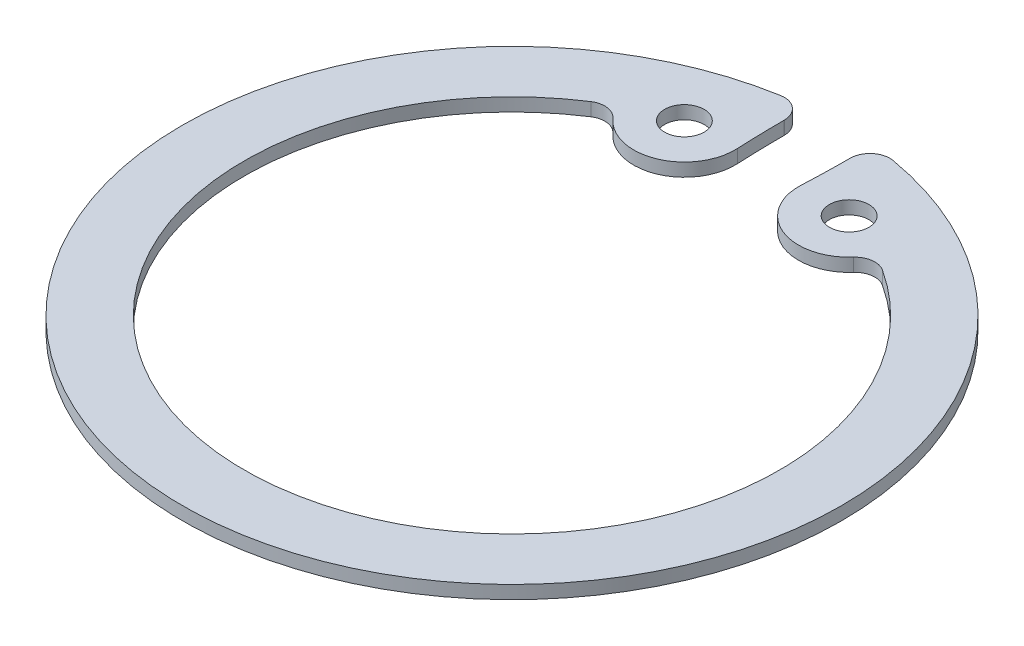
ISO-10303-21;
HEADER;
FILE_DESCRIPTION(('STEP AP214'),'2;1');
FILE_NAME('part.step','',(''),(''),'','','');
FILE_SCHEMA(('AUTOMOTIVE_DESIGN { 1 0 10303 214 1 1 1 1 }'));
ENDSEC;
DATA;
#1=APPLICATION_CONTEXT('core data for automotive mechanical design processes');
#2=APPLICATION_PROTOCOL_DEFINITION('international standard','automotive_design',2000,#1);
#3=PRODUCT_CONTEXT('',#1,'mechanical');
#4=PRODUCT('Part','Part','',(#3));
#5=PRODUCT_RELATED_PRODUCT_CATEGORY('part','',(#4));
#6=PRODUCT_DEFINITION_FORMATION('','',#4);
#7=PRODUCT_DEFINITION_CONTEXT('part definition',#1,'design');
#8=PRODUCT_DEFINITION('design','',#6,#7);
#9=PRODUCT_DEFINITION_SHAPE('','',#8);
#10=(LENGTH_UNIT() NAMED_UNIT(*) SI_UNIT(.MILLI.,.METRE.));
#11=(NAMED_UNIT(*) PLANE_ANGLE_UNIT() SI_UNIT($,.RADIAN.));
#12=(NAMED_UNIT(*) SI_UNIT($,.STERADIAN.) SOLID_ANGLE_UNIT());
#13=UNCERTAINTY_MEASURE_WITH_UNIT(LENGTH_MEASURE(1.E-05),#10,'distance_accuracy_value','');
#14=(GEOMETRIC_REPRESENTATION_CONTEXT(3) GLOBAL_UNCERTAINTY_ASSIGNED_CONTEXT((#13)) GLOBAL_UNIT_ASSIGNED_CONTEXT((#10,
#11,#12)) REPRESENTATION_CONTEXT('',''));
#15=CARTESIAN_POINT('',(0.,0.,0.));
#16=DIRECTION('',(0.,0.,1.));
#17=DIRECTION('',(1.,0.,0.));
#18=AXIS2_PLACEMENT_3D('',#15,#16,#17);
#19=CARTESIAN_POINT('',(0.,0.508,0.));
#20=DIRECTION('',(0.,1.,0.));
#21=DIRECTION('',(0.,0.,1.));
#22=AXIS2_PLACEMENT_3D('',#19,#20,#21);
#23=PLANE('',#22);
#24=CARTESIAN_POINT('',(0.,0.508,0.));
#25=DIRECTION('',(0.,1.,0.));
#26=DIRECTION('',(0.,0.,1.));
#27=AXIS2_PLACEMENT_3D('',#24,#25,#26);
#28=CIRCLE('',#27,10.31875);
#29=CARTESIAN_POINT('',(-5.61818155112389,0.508,-8.65520869887671));
#30=VERTEX_POINT('',#29);
#31=CARTESIAN_POINT('',(5.61818155112389,0.508,-8.65520869887671));
#32=VERTEX_POINT('',#31);
#33=EDGE_CURVE('E189',#30,#32,#28,.T.);
#34=ORIENTED_EDGE('',*,*,#33,.F.);
#35=CARTESIAN_POINT('',(-5.20330045196397,0.508,-8.01605482572889));
#36=DIRECTION('',(0.,-1.,0.));
#37=DIRECTION('',(0.,0.,1.));
#38=AXIS2_PLACEMENT_3D('',#35,#36,#37);
#39=CIRCLE('',#38,0.762);
#40=CARTESIAN_POINT('',(-4.63365696517477,0.508,-8.5221677557738));
#41=VERTEX_POINT('',#40);
#42=EDGE_CURVE('E158',#41,#30,#39,.F.);
#43=ORIENTED_EDGE('',*,*,#42,.F.);
#44=CARTESIAN_POINT('',(-3.175,0.508,-9.81814527100205));
#45=DIRECTION('',(0.,-1.,0.));
#46=DIRECTION('',(0.,0.,1.));
#47=AXIS2_PLACEMENT_3D('',#44,#45,#46);
#48=CIRCLE('',#47,1.95121445823622);
#49=CARTESIAN_POINT('',(-1.22599498104189,0.508,-9.91097467424356));
#50=VERTEX_POINT('',#49);
#51=EDGE_CURVE('E297',#50,#41,#48,.T.);
#52=ORIENTED_EDGE('',*,*,#51,.F.);
#53=CARTESIAN_POINT('',(37.592,0.508,-11.7598418008393));
#54=DIRECTION('',(0.,-1.,0.));
#55=DIRECTION('',(0.,0.,1.));
#56=AXIS2_PLACEMENT_3D('',#53,#54,#55);
#57=CIRCLE('',#56,38.862);
#58=CARTESIAN_POINT('',(-1.27,0.508,-11.7598418008393));
#59=VERTEX_POINT('',#58);
#60=EDGE_CURVE('E168',#59,#50,#57,.F.);
#61=ORIENTED_EDGE('',*,*,#60,.F.);
#62=DIRECTION('',(0.,0.,-1.));
#63=VECTOR('',#62,1.);
#64=CARTESIAN_POINT('',(-1.27,0.508,-9.15960984272477));
#65=LINE('',#64,#63);
#66=CARTESIAN_POINT('',(-1.27,0.508,-11.76379275574));
#67=VERTEX_POINT('',#66);
#68=EDGE_CURVE('E147',#59,#67,#65,.T.);
#69=ORIENTED_EDGE('',*,*,#68,.T.);
#70=CARTESIAN_POINT('',(-2.032,0.508,-11.76379275574));
#71=DIRECTION('',(0.,-1.,0.));
#72=DIRECTION('',(0.,0.,1.));
#73=AXIS2_PLACEMENT_3D('',#70,#71,#72);
#74=CIRCLE('',#73,0.762);
#75=CARTESIAN_POINT('',(-2.16170212765957,0.508,-12.5146731444042));
#76=VERTEX_POINT('',#75);
#77=EDGE_CURVE('E138',#76,#67,#74,.T.);
#78=ORIENTED_EDGE('',*,*,#77,.F.);
#79=CARTESIAN_POINT('',(0.,0.508,0.));
#80=DIRECTION('',(0.,1.,0.));
#81=DIRECTION('',(0.,0.,1.));
#82=AXIS2_PLACEMENT_3D('',#79,#80,#81);
#83=CIRCLE('',#82,12.7);
#84=CARTESIAN_POINT('',(2.16170212765957,0.508,-12.5146731444042));
#85=VERTEX_POINT('',#84);
#86=EDGE_CURVE('E123',#76,#85,#83,.T.);
#87=ORIENTED_EDGE('',*,*,#86,.T.);
#88=CARTESIAN_POINT('',(2.032,0.508,-11.76379275574));
#89=DIRECTION('',(0.,1.,0.));
#90=DIRECTION('',(0.,0.,1.));
#91=AXIS2_PLACEMENT_3D('',#88,#89,#90);
#92=CIRCLE('',#91,0.762);
#93=CARTESIAN_POINT('',(1.27,0.508,-11.76379275574));
#94=VERTEX_POINT('',#93);
#95=EDGE_CURVE('E199',#85,#94,#92,.T.);
#96=ORIENTED_EDGE('',*,*,#95,.T.);
#97=DIRECTION('',(0.,0.,-1.));
#98=VECTOR('',#97,1.);
#99=CARTESIAN_POINT('',(1.27,0.508,-9.15960984272477));
#100=LINE('',#99,#98);
#101=CARTESIAN_POINT('',(1.27,0.508,-11.7598418008393));
#102=VERTEX_POINT('',#101);
#103=EDGE_CURVE('E183',#102,#94,#100,.T.);
#104=ORIENTED_EDGE('',*,*,#103,.F.);
#105=CARTESIAN_POINT('',(-37.592,0.508,-11.7598418008393));
#106=DIRECTION('',(0.,1.,0.));
#107=DIRECTION('',(0.,0.,1.));
#108=AXIS2_PLACEMENT_3D('',#105,#106,#107);
#109=CIRCLE('',#108,38.862);
#110=CARTESIAN_POINT('',(1.22599498104189,0.508,-9.91097467424356));
#111=VERTEX_POINT('',#110);
#112=EDGE_CURVE('E44',#102,#111,#109,.F.);
#113=ORIENTED_EDGE('',*,*,#112,.T.);
#114=CARTESIAN_POINT('',(3.175,0.508,-9.81814527100205));
#115=DIRECTION('',(0.,1.,0.));
#116=DIRECTION('',(0.,0.,1.));
#117=AXIS2_PLACEMENT_3D('',#114,#115,#116);
#118=CIRCLE('',#117,1.95121445823622);
#119=CARTESIAN_POINT('',(4.63365696517477,0.508,-8.5221677557738));
#120=VERTEX_POINT('',#119);
#121=EDGE_CURVE('E178',#111,#120,#118,.T.);
#122=ORIENTED_EDGE('',*,*,#121,.T.);
#123=CARTESIAN_POINT('',(5.20330045196397,0.508,-8.01605482572889));
#124=DIRECTION('',(0.,1.,0.));
#125=DIRECTION('',(0.,0.,1.));
#126=AXIS2_PLACEMENT_3D('',#123,#124,#125);
#127=CIRCLE('',#126,0.762);
#128=EDGE_CURVE('E209',#120,#32,#127,.F.);
#129=ORIENTED_EDGE('',*,*,#128,.T.);
#130=EDGE_LOOP('',(#34,#43,#52,#61,#69,#78,#87,#96,#104,#113,#122,#129));
#131=FACE_BOUND('',#130,.T.);
#132=CARTESIAN_POINT('',(3.175,0.508,-9.81814527100205));
#133=DIRECTION('',(0.,1.,0.));
#134=DIRECTION('',(0.,0.,1.));
#135=AXIS2_PLACEMENT_3D('',#132,#133,#134);
#136=CIRCLE('',#135,0.762);
#137=CARTESIAN_POINT('',(3.175,0.508,-9.05614527100205));
#138=VERTEX_POINT('',#137);
#139=EDGE_CURVE('E174',#138,#138,#136,.T.);
#140=ORIENTED_EDGE('',*,*,#139,.F.);
#141=EDGE_LOOP('',(#140));
#142=FACE_BOUND('',#141,.T.);
#143=CARTESIAN_POINT('',(-3.175,0.508,-9.81814527100205));
#144=DIRECTION('',(0.,-1.,0.));
#145=DIRECTION('',(0.,0.,1.));
#146=AXIS2_PLACEMENT_3D('',#143,#144,#145);
#147=CIRCLE('',#146,0.762);
#148=CARTESIAN_POINT('',(-3.175,0.508,-9.05614527100205));
#149=VERTEX_POINT('',#148);
#150=EDGE_CURVE('E294',#149,#149,#147,.T.);
#151=ORIENTED_EDGE('',*,*,#150,.T.);
#152=EDGE_LOOP('',(#151));
#153=FACE_BOUND('',#152,.T.);
#154=ADVANCED_FACE('F36',(#131,#142,#153),#23,.T.);
#155=CARTESIAN_POINT('',(0.,0.,0.));
#156=DIRECTION('',(0.,1.,0.));
#157=DIRECTION('',(0.,0.,1.));
#158=AXIS2_PLACEMENT_3D('',#155,#156,#157);
#159=PLANE('',#158);
#160=CARTESIAN_POINT('',(3.175,0.,-9.81814527100205));
#161=DIRECTION('',(0.,1.,0.));
#162=DIRECTION('',(0.,0.,1.));
#163=AXIS2_PLACEMENT_3D('',#160,#161,#162);
#164=CIRCLE('',#163,0.762);
#165=CARTESIAN_POINT('',(3.175,0.,-9.05614527100205));
#166=VERTEX_POINT('',#165);
#167=EDGE_CURVE('E175',#166,#166,#164,.T.);
#168=ORIENTED_EDGE('',*,*,#167,.T.);
#169=EDGE_LOOP('',(#168));
#170=FACE_BOUND('',#169,.T.);
#171=CARTESIAN_POINT('',(0.,0.,0.));
#172=DIRECTION('',(0.,1.,0.));
#173=DIRECTION('',(0.,0.,1.));
#174=AXIS2_PLACEMENT_3D('',#171,#172,#173);
#175=CIRCLE('',#174,12.7);
#176=CARTESIAN_POINT('',(-2.16170212765957,0.,-12.5146731444042));
#177=VERTEX_POINT('',#176);
#178=CARTESIAN_POINT('',(2.16170212765957,0.,-12.5146731444042));
#179=VERTEX_POINT('',#178);
#180=EDGE_CURVE('E133',#177,#179,#175,.T.);
#181=ORIENTED_EDGE('',*,*,#180,.F.);
#182=CARTESIAN_POINT('',(-2.032,0.,-11.76379275574));
#183=DIRECTION('',(0.,-1.,0.));
#184=DIRECTION('',(0.,0.,1.));
#185=AXIS2_PLACEMENT_3D('',#182,#183,#184);
#186=CIRCLE('',#185,0.762);
#187=CARTESIAN_POINT('',(-1.27,0.,-11.76379275574));
#188=VERTEX_POINT('',#187);
#189=EDGE_CURVE('E141',#188,#177,#186,.F.);
#190=ORIENTED_EDGE('',*,*,#189,.F.);
#191=DIRECTION('',(0.,0.,-1.));
#192=VECTOR('',#191,1.);
#193=CARTESIAN_POINT('',(-1.27,0.,-9.15960984272477));
#194=LINE('',#193,#192);
#195=CARTESIAN_POINT('',(-1.27,0.,-11.7598418008393));
#196=VERTEX_POINT('',#195);
#197=EDGE_CURVE('E142',#196,#188,#194,.T.);
#198=ORIENTED_EDGE('',*,*,#197,.F.);
#199=CARTESIAN_POINT('',(37.592,0.,-11.7598418008393));
#200=DIRECTION('',(0.,-1.,0.));
#201=DIRECTION('',(0.,0.,1.));
#202=AXIS2_PLACEMENT_3D('',#199,#200,#201);
#203=CIRCLE('',#202,38.862);
#204=CARTESIAN_POINT('',(-1.22599498104189,0.,-9.91097467424356));
#205=VERTEX_POINT('',#204);
#206=EDGE_CURVE('E171',#205,#196,#203,.T.);
#207=ORIENTED_EDGE('',*,*,#206,.F.);
#208=CARTESIAN_POINT('',(-3.175,0.,-9.81814527100205));
#209=DIRECTION('',(0.,-1.,0.));
#210=DIRECTION('',(0.,0.,1.));
#211=AXIS2_PLACEMENT_3D('',#208,#209,#210);
#212=CIRCLE('',#211,1.95121445823622);
#213=CARTESIAN_POINT('',(-4.63365696517477,0.,-8.5221677557738));
#214=VERTEX_POINT('',#213);
#215=EDGE_CURVE('E300',#205,#214,#212,.T.);
#216=ORIENTED_EDGE('',*,*,#215,.T.);
#217=CARTESIAN_POINT('',(-5.20330045196397,0.,-8.01605482572889));
#218=DIRECTION('',(0.,-1.,0.));
#219=DIRECTION('',(0.,0.,1.));
#220=AXIS2_PLACEMENT_3D('',#217,#218,#219);
#221=CIRCLE('',#220,0.762);
#222=CARTESIAN_POINT('',(-5.61818155112389,0.,-8.65520869887671));
#223=VERTEX_POINT('',#222);
#224=EDGE_CURVE('E161',#223,#214,#221,.T.);
#225=ORIENTED_EDGE('',*,*,#224,.F.);
#226=CARTESIAN_POINT('',(0.,0.,0.));
#227=DIRECTION('',(0.,1.,0.));
#228=DIRECTION('',(0.,0.,1.));
#229=AXIS2_PLACEMENT_3D('',#226,#227,#228);
#230=CIRCLE('',#229,10.31875);
#231=CARTESIAN_POINT('',(5.61818155112389,0.,-8.65520869887671));
#232=VERTEX_POINT('',#231);
#233=EDGE_CURVE('E187',#223,#232,#230,.T.);
#234=ORIENTED_EDGE('',*,*,#233,.T.);
#235=CARTESIAN_POINT('',(5.20330045196397,0.,-8.01605482572889));
#236=DIRECTION('',(0.,1.,0.));
#237=DIRECTION('',(0.,0.,1.));
#238=AXIS2_PLACEMENT_3D('',#235,#236,#237);
#239=CIRCLE('',#238,0.762);
#240=CARTESIAN_POINT('',(4.63365696517477,0.,-8.5221677557738));
#241=VERTEX_POINT('',#240);
#242=EDGE_CURVE('E211',#232,#241,#239,.T.);
#243=ORIENTED_EDGE('',*,*,#242,.T.);
#244=CARTESIAN_POINT('',(3.175,0.,-9.81814527100205));
#245=DIRECTION('',(0.,1.,0.));
#246=DIRECTION('',(0.,0.,1.));
#247=AXIS2_PLACEMENT_3D('',#244,#245,#246);
#248=CIRCLE('',#247,1.95121445823622);
#249=CARTESIAN_POINT('',(1.22599498104189,0.,-9.91097467424356));
#250=VERTEX_POINT('',#249);
#251=EDGE_CURVE('E181',#250,#241,#248,.T.);
#252=ORIENTED_EDGE('',*,*,#251,.F.);
#253=CARTESIAN_POINT('',(-37.592,0.,-11.7598418008393));
#254=DIRECTION('',(0.,1.,0.));
#255=DIRECTION('',(0.,0.,1.));
#256=AXIS2_PLACEMENT_3D('',#253,#254,#255);
#257=CIRCLE('',#256,38.862);
#258=CARTESIAN_POINT('',(1.27,0.,-11.7598418008393));
#259=VERTEX_POINT('',#258);
#260=EDGE_CURVE('E11',#250,#259,#257,.T.);
#261=ORIENTED_EDGE('',*,*,#260,.T.);
#262=DIRECTION('',(0.,0.,-1.));
#263=VECTOR('',#262,1.);
#264=CARTESIAN_POINT('',(1.27,0.,-9.15960984272477));
#265=LINE('',#264,#263);
#266=CARTESIAN_POINT('',(1.27,0.,-11.76379275574));
#267=VERTEX_POINT('',#266);
#268=EDGE_CURVE('E185',#259,#267,#265,.T.);
#269=ORIENTED_EDGE('',*,*,#268,.T.);
#270=CARTESIAN_POINT('',(2.032,0.,-11.76379275574));
#271=DIRECTION('',(0.,1.,0.));
#272=DIRECTION('',(0.,0.,1.));
#273=AXIS2_PLACEMENT_3D('',#270,#271,#272);
#274=CIRCLE('',#273,0.762);
#275=EDGE_CURVE('E196',#267,#179,#274,.F.);
#276=ORIENTED_EDGE('',*,*,#275,.T.);
#277=EDGE_LOOP('',(#181,#190,#198,#207,#216,#225,#234,#243,#252,#261,#269,#276));
#278=FACE_BOUND('',#277,.T.);
#279=CARTESIAN_POINT('',(-3.175,0.,-9.81814527100205));
#280=DIRECTION('',(0.,-1.,0.));
#281=DIRECTION('',(0.,0.,1.));
#282=AXIS2_PLACEMENT_3D('',#279,#280,#281);
#283=CIRCLE('',#282,0.762);
#284=CARTESIAN_POINT('',(-3.175,0.,-9.05614527100205));
#285=VERTEX_POINT('',#284);
#286=EDGE_CURVE('E291',#285,#285,#283,.T.);
#287=ORIENTED_EDGE('',*,*,#286,.F.);
#288=EDGE_LOOP('',(#287));
#289=FACE_BOUND('',#288,.T.);
#290=ADVANCED_FACE('F228',(#170,#278,#289),#159,.F.);
#291=CARTESIAN_POINT('',(0.,0.508,0.));
#292=DIRECTION('',(0.,-1.,0.));
#293=DIRECTION('',(0.,0.,-1.));
#294=AXIS2_PLACEMENT_3D('',#291,#292,#293);
#295=CYLINDRICAL_SURFACE('',#294,12.7);
#296=ORIENTED_EDGE('',*,*,#86,.F.);
#297=DIRECTION('',(0.,-1.,0.));
#298=VECTOR('',#297,1.);
#299=CARTESIAN_POINT('',(-2.16170212765958,0.508,-12.5146731444042));
#300=LINE('',#299,#298);
#301=EDGE_CURVE('E126',#177,#76,#300,.F.);
#302=ORIENTED_EDGE('',*,*,#301,.F.);
#303=ORIENTED_EDGE('',*,*,#180,.T.);
#304=DIRECTION('',(0.,-1.,0.));
#305=VECTOR('',#304,1.);
#306=CARTESIAN_POINT('',(2.16170212765958,0.508,-12.5146731444042));
#307=LINE('',#306,#305);
#308=EDGE_CURVE('E129',#179,#85,#307,.F.);
#309=ORIENTED_EDGE('',*,*,#308,.T.);
#310=EDGE_LOOP('',(#296,#302,#303,#309));
#311=FACE_BOUND('',#310,.T.);
#312=ADVANCED_FACE('F125',(#311),#295,.T.);
#313=CARTESIAN_POINT('',(0.,0.508,0.));
#314=DIRECTION('',(0.,-1.,0.));
#315=DIRECTION('',(0.,0.,-1.));
#316=AXIS2_PLACEMENT_3D('',#313,#314,#315);
#317=CYLINDRICAL_SURFACE('',#316,10.31875);
#318=ORIENTED_EDGE('',*,*,#33,.T.);
#319=DIRECTION('',(0.,-1.,0.));
#320=VECTOR('',#319,1.);
#321=CARTESIAN_POINT('',(5.61818155112389,0.508,-8.65520869887671));
#322=LINE('',#321,#320);
#323=EDGE_CURVE('E207',#32,#232,#322,.T.);
#324=ORIENTED_EDGE('',*,*,#323,.T.);
#325=ORIENTED_EDGE('',*,*,#233,.F.);
#326=DIRECTION('',(0.,-1.,0.));
#327=VECTOR('',#326,1.);
#328=CARTESIAN_POINT('',(-5.61818155112389,0.508,-8.65520869887671));
#329=LINE('',#328,#327);
#330=EDGE_CURVE('E155',#30,#223,#329,.T.);
#331=ORIENTED_EDGE('',*,*,#330,.F.);
#332=EDGE_LOOP('',(#318,#324,#325,#331));
#333=FACE_BOUND('',#332,.T.);
#334=ADVANCED_FACE('F249',(#333),#317,.F.);
#335=CARTESIAN_POINT('',(1.27,0.,-9.15960984272477));
#336=DIRECTION('',(1.,0.,0.));
#337=DIRECTION('',(0.,0.,-1.));
#338=AXIS2_PLACEMENT_3D('',#335,#336,#337);
#339=PLANE('',#338);
#340=ORIENTED_EDGE('',*,*,#268,.F.);
#341=DIRECTION('',(0.,1.,0.));
#342=VECTOR('',#341,1.);
#343=CARTESIAN_POINT('',(1.27,0.,-11.7598418008393));
#344=LINE('',#343,#342);
#345=EDGE_CURVE('E214',#259,#102,#344,.T.);
#346=ORIENTED_EDGE('',*,*,#345,.T.);
#347=ORIENTED_EDGE('',*,*,#103,.T.);
#348=DIRECTION('',(0.,-1.,0.));
#349=VECTOR('',#348,1.);
#350=CARTESIAN_POINT('',(1.27,0.,-11.76379275574));
#351=LINE('',#350,#349);
#352=EDGE_CURVE('E201',#94,#267,#351,.T.);
#353=ORIENTED_EDGE('',*,*,#352,.T.);
#354=EDGE_LOOP('',(#340,#346,#347,#353));
#355=FACE_BOUND('',#354,.T.);
#356=ADVANCED_FACE('F220',(#355),#339,.F.);
#357=CARTESIAN_POINT('',(2.032,0.508,-11.76379275574));
#358=DIRECTION('',(0.,-1.,0.));
#359=DIRECTION('',(0.,0.,-1.));
#360=AXIS2_PLACEMENT_3D('',#357,#358,#359);
#361=CYLINDRICAL_SURFACE('',#360,0.762);
#362=ORIENTED_EDGE('',*,*,#275,.F.);
#363=ORIENTED_EDGE('',*,*,#352,.F.);
#364=ORIENTED_EDGE('',*,*,#95,.F.);
#365=ORIENTED_EDGE('',*,*,#308,.F.);
#366=EDGE_LOOP('',(#362,#363,#364,#365));
#367=FACE_BOUND('',#366,.T.);
#368=ADVANCED_FACE('F226',(#367),#361,.T.);
#369=CARTESIAN_POINT('',(3.175,0.,-9.81814527100205));
#370=DIRECTION('',(0.,1.,0.));
#371=DIRECTION('',(0.,0.,1.));
#372=AXIS2_PLACEMENT_3D('',#369,#370,#371);
#373=CYLINDRICAL_SURFACE('',#372,1.95121445823622);
#374=ORIENTED_EDGE('',*,*,#121,.F.);
#375=DIRECTION('',(0.,1.,0.));
#376=VECTOR('',#375,1.);
#377=CARTESIAN_POINT('',(1.22599498104189,0.,-9.91097467424356));
#378=LINE('',#377,#376);
#379=EDGE_CURVE('E57',#111,#250,#378,.F.);
#380=ORIENTED_EDGE('',*,*,#379,.T.);
#381=ORIENTED_EDGE('',*,*,#251,.T.);
#382=DIRECTION('',(0.,1.,0.));
#383=VECTOR('',#382,1.);
#384=CARTESIAN_POINT('',(4.63365696517477,0.,-8.5221677557738));
#385=LINE('',#384,#383);
#386=EDGE_CURVE('E204',#241,#120,#385,.T.);
#387=ORIENTED_EDGE('',*,*,#386,.T.);
#388=EDGE_LOOP('',(#374,#380,#381,#387));
#389=FACE_BOUND('',#388,.T.);
#390=ADVANCED_FACE('F255',(#389),#373,.T.);
#391=CARTESIAN_POINT('',(3.175,0.,-9.81814527100205));
#392=DIRECTION('',(0.,1.,0.));
#393=DIRECTION('',(0.,0.,1.));
#394=AXIS2_PLACEMENT_3D('',#391,#392,#393);
#395=CYLINDRICAL_SURFACE('',#394,0.762);
#396=ORIENTED_EDGE('',*,*,#167,.F.);
#397=EDGE_LOOP('',(#396));
#398=FACE_BOUND('',#397,.T.);
#399=ORIENTED_EDGE('',*,*,#139,.T.);
#400=EDGE_LOOP('',(#399));
#401=FACE_BOUND('',#400,.T.);
#402=ADVANCED_FACE('F239',(#398,#401),#395,.F.);
#403=CARTESIAN_POINT('',(5.20330045196397,0.508,-8.01605482572889));
#404=DIRECTION('',(0.,1.,0.));
#405=DIRECTION('',(0.,0.,1.));
#406=AXIS2_PLACEMENT_3D('',#403,#404,#405);
#407=CYLINDRICAL_SURFACE('',#406,0.762);
#408=ORIENTED_EDGE('',*,*,#242,.F.);
#409=ORIENTED_EDGE('',*,*,#323,.F.);
#410=ORIENTED_EDGE('',*,*,#128,.F.);
#411=ORIENTED_EDGE('',*,*,#386,.F.);
#412=EDGE_LOOP('',(#408,#409,#410,#411));
#413=FACE_BOUND('',#412,.T.);
#414=ADVANCED_FACE('F232',(#413),#407,.F.);
#415=CARTESIAN_POINT('',(-37.592,0.,-11.7598418008393));
#416=DIRECTION('',(0.,1.,0.));
#417=DIRECTION('',(0.,0.,1.));
#418=AXIS2_PLACEMENT_3D('',#415,#416,#417);
#419=CYLINDRICAL_SURFACE('',#418,38.862);
#420=ORIENTED_EDGE('',*,*,#260,.F.);
#421=ORIENTED_EDGE('',*,*,#379,.F.);
#422=ORIENTED_EDGE('',*,*,#112,.F.);
#423=ORIENTED_EDGE('',*,*,#345,.F.);
#424=EDGE_LOOP('',(#420,#421,#422,#423));
#425=FACE_BOUND('',#424,.T.);
#426=ADVANCED_FACE('F38',(#425),#419,.F.);
#427=CARTESIAN_POINT('',(-1.27,0.,-9.15960984272477));
#428=DIRECTION('',(-1.,0.,0.));
#429=DIRECTION('',(0.,0.,-1.));
#430=AXIS2_PLACEMENT_3D('',#427,#428,#429);
#431=PLANE('',#430);
#432=ORIENTED_EDGE('',*,*,#197,.T.);
#433=DIRECTION('',(0.,-1.,0.));
#434=VECTOR('',#433,1.);
#435=CARTESIAN_POINT('',(-1.27,0.,-11.76379275574));
#436=LINE('',#435,#434);
#437=EDGE_CURVE('E148',#67,#188,#436,.T.);
#438=ORIENTED_EDGE('',*,*,#437,.F.);
#439=ORIENTED_EDGE('',*,*,#68,.F.);
#440=DIRECTION('',(0.,1.,0.));
#441=VECTOR('',#440,1.);
#442=CARTESIAN_POINT('',(-1.27,0.,-11.7598418008393));
#443=LINE('',#442,#441);
#444=EDGE_CURVE('E164',#196,#59,#443,.T.);
#445=ORIENTED_EDGE('',*,*,#444,.F.);
#446=EDGE_LOOP('',(#432,#438,#439,#445));
#447=FACE_BOUND('',#446,.T.);
#448=ADVANCED_FACE('F231',(#447),#431,.F.);
#449=CARTESIAN_POINT('',(-2.032,0.508,-11.76379275574));
#450=DIRECTION('',(0.,-1.,0.));
#451=DIRECTION('',(0.,0.,-1.));
#452=AXIS2_PLACEMENT_3D('',#449,#450,#451);
#453=CYLINDRICAL_SURFACE('',#452,0.762);
#454=ORIENTED_EDGE('',*,*,#189,.T.);
#455=ORIENTED_EDGE('',*,*,#301,.T.);
#456=ORIENTED_EDGE('',*,*,#77,.T.);
#457=ORIENTED_EDGE('',*,*,#437,.T.);
#458=EDGE_LOOP('',(#454,#455,#456,#457));
#459=FACE_BOUND('',#458,.T.);
#460=ADVANCED_FACE('F137',(#459),#453,.T.);
#461=CARTESIAN_POINT('',(-3.175,0.,-9.81814527100205));
#462=DIRECTION('',(0.,1.,0.));
#463=DIRECTION('',(0.,0.,1.));
#464=AXIS2_PLACEMENT_3D('',#461,#462,#463);
#465=CYLINDRICAL_SURFACE('',#464,1.95121445823622);
#466=ORIENTED_EDGE('',*,*,#51,.T.);
#467=DIRECTION('',(0.,1.,0.));
#468=VECTOR('',#467,1.);
#469=CARTESIAN_POINT('',(-4.63365696517477,0.,-8.5221677557738));
#470=LINE('',#469,#468);
#471=EDGE_CURVE('E150',#214,#41,#470,.T.);
#472=ORIENTED_EDGE('',*,*,#471,.F.);
#473=ORIENTED_EDGE('',*,*,#215,.F.);
#474=DIRECTION('',(0.,1.,0.));
#475=VECTOR('',#474,1.);
#476=CARTESIAN_POINT('',(-1.22599498104189,0.,-9.91097467424356));
#477=LINE('',#476,#475);
#478=EDGE_CURVE('E166',#50,#205,#477,.F.);
#479=ORIENTED_EDGE('',*,*,#478,.F.);
#480=EDGE_LOOP('',(#466,#472,#473,#479));
#481=FACE_BOUND('',#480,.T.);
#482=ADVANCED_FACE('F279',(#481),#465,.T.);
#483=CARTESIAN_POINT('',(-3.175,0.,-9.81814527100205));
#484=DIRECTION('',(0.,1.,0.));
#485=DIRECTION('',(0.,0.,1.));
#486=AXIS2_PLACEMENT_3D('',#483,#484,#485);
#487=CYLINDRICAL_SURFACE('',#486,0.762);
#488=ORIENTED_EDGE('',*,*,#286,.T.);
#489=EDGE_LOOP('',(#488));
#490=FACE_BOUND('',#489,.T.);
#491=ORIENTED_EDGE('',*,*,#150,.F.);
#492=EDGE_LOOP('',(#491));
#493=FACE_BOUND('',#492,.T.);
#494=ADVANCED_FACE('F276',(#490,#493),#487,.F.);
#495=CARTESIAN_POINT('',(-5.20330045196397,0.508,-8.01605482572889));
#496=DIRECTION('',(0.,1.,0.));
#497=DIRECTION('',(0.,0.,1.));
#498=AXIS2_PLACEMENT_3D('',#495,#496,#497);
#499=CYLINDRICAL_SURFACE('',#498,0.762);
#500=ORIENTED_EDGE('',*,*,#224,.T.);
#501=ORIENTED_EDGE('',*,*,#471,.T.);
#502=ORIENTED_EDGE('',*,*,#42,.T.);
#503=ORIENTED_EDGE('',*,*,#330,.T.);
#504=EDGE_LOOP('',(#500,#501,#502,#503));
#505=FACE_BOUND('',#504,.T.);
#506=ADVANCED_FACE('F272',(#505),#499,.F.);
#507=CARTESIAN_POINT('',(37.592,0.,-11.7598418008393));
#508=DIRECTION('',(0.,1.,0.));
#509=DIRECTION('',(0.,0.,1.));
#510=AXIS2_PLACEMENT_3D('',#507,#508,#509);
#511=CYLINDRICAL_SURFACE('',#510,38.862);
#512=ORIENTED_EDGE('',*,*,#206,.T.);
#513=ORIENTED_EDGE('',*,*,#444,.T.);
#514=ORIENTED_EDGE('',*,*,#60,.T.);
#515=ORIENTED_EDGE('',*,*,#478,.T.);
#516=EDGE_LOOP('',(#512,#513,#514,#515));
#517=FACE_BOUND('',#516,.T.);
#518=ADVANCED_FACE('F269',(#517),#511,.F.);
#519=CLOSED_SHELL('',(#154,#290,#312,#334,#356,#368,#390,#402,#414,#426,#448,#460,#482,#494,
#506,#518));
#520=MANIFOLD_SOLID_BREP('B2',#519);
#521=ADVANCED_BREP_SHAPE_REPRESENTATION('',(#18,#520),#14);
#522=SHAPE_DEFINITION_REPRESENTATION(#9,#521);
ENDSEC;
END-ISO-10303-21;
